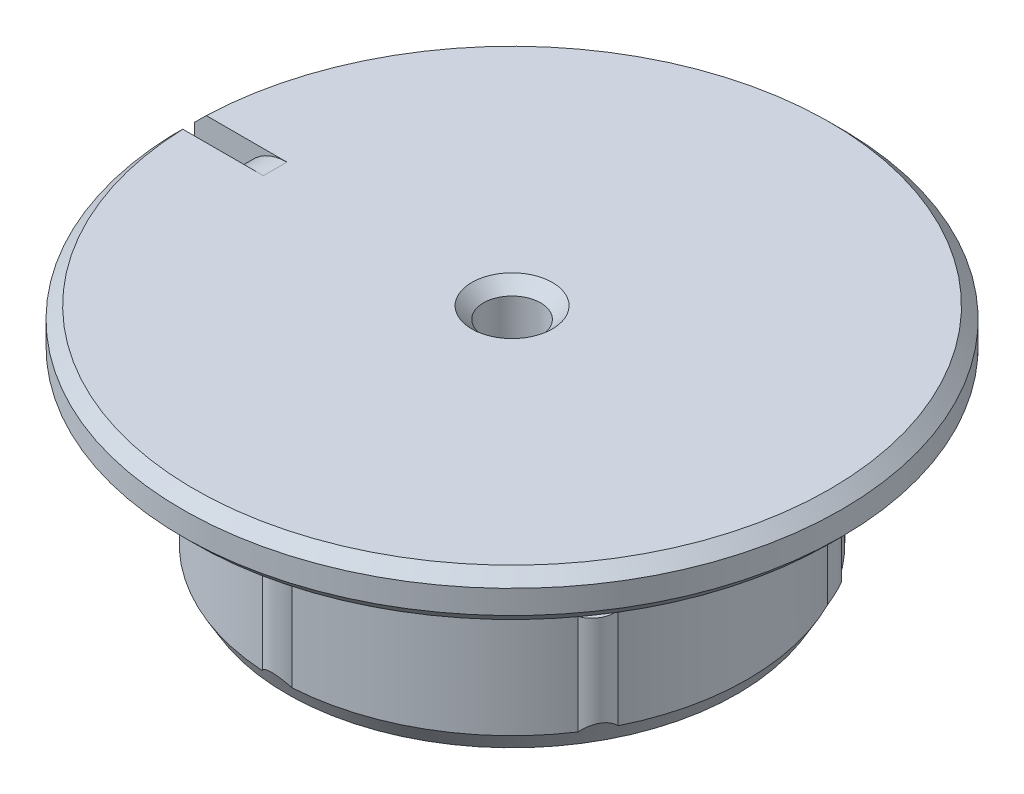
ISO-10303-21;
HEADER;
FILE_DESCRIPTION(('STEP AP214'),'2;1');
FILE_NAME('part.step','',(''),(''),'','','');
FILE_SCHEMA(('AUTOMOTIVE_DESIGN { 1 0 10303 214 1 1 1 1 }'));
ENDSEC;
DATA;
#1=APPLICATION_CONTEXT('core data for automotive mechanical design processes');
#2=APPLICATION_PROTOCOL_DEFINITION('international standard','automotive_design',2000,#1);
#3=PRODUCT_CONTEXT('',#1,'mechanical');
#4=PRODUCT('Part','Part','',(#3));
#5=PRODUCT_RELATED_PRODUCT_CATEGORY('part','',(#4));
#6=PRODUCT_DEFINITION_FORMATION('','',#4);
#7=PRODUCT_DEFINITION_CONTEXT('part definition',#1,'design');
#8=PRODUCT_DEFINITION('design','',#6,#7);
#9=PRODUCT_DEFINITION_SHAPE('','',#8);
#10=(LENGTH_UNIT() NAMED_UNIT(*) SI_UNIT(.MILLI.,.METRE.));
#11=(NAMED_UNIT(*) PLANE_ANGLE_UNIT() SI_UNIT($,.RADIAN.));
#12=(NAMED_UNIT(*) SI_UNIT($,.STERADIAN.) SOLID_ANGLE_UNIT());
#13=UNCERTAINTY_MEASURE_WITH_UNIT(LENGTH_MEASURE(1.E-05),#10,'distance_accuracy_value','');
#14=(GEOMETRIC_REPRESENTATION_CONTEXT(3) GLOBAL_UNCERTAINTY_ASSIGNED_CONTEXT((#13)) GLOBAL_UNIT_ASSIGNED_CONTEXT((#10,
#11,#12)) REPRESENTATION_CONTEXT('',''));
#15=CARTESIAN_POINT('',(0.,0.,0.));
#16=DIRECTION('',(0.,0.,1.));
#17=DIRECTION('',(1.,0.,0.));
#18=AXIS2_PLACEMENT_3D('',#15,#16,#17);
#19=CARTESIAN_POINT('',(0.,0.,0.));
#20=DIRECTION('',(0.,-1.,0.));
#21=DIRECTION('',(0.,0.,-1.));
#22=AXIS2_PLACEMENT_3D('',#19,#20,#21);
#23=CYLINDRICAL_SURFACE('',#22,28.);
#24=DIRECTION('',(0.,-1.,0.));
#25=VECTOR('',#24,1.);
#26=CARTESIAN_POINT('',(-27.9821371592664,0.,-1.));
#27=LINE('',#26,#25);
#28=CARTESIAN_POINT('',(-27.9821371592664,18.,-1.));
#29=VERTEX_POINT('',#28);
#30=CARTESIAN_POINT('',(-27.9821371592664,16.,-1.));
#31=VERTEX_POINT('',#30);
#32=EDGE_CURVE('E284',#29,#31,#27,.T.);
#33=ORIENTED_EDGE('',*,*,#32,.F.);
#34=CARTESIAN_POINT('',(0.,18.,0.));
#35=DIRECTION('',(0.,1.,0.));
#36=DIRECTION('',(0.,0.,1.));
#37=AXIS2_PLACEMENT_3D('',#34,#35,#36);
#38=CIRCLE('',#37,28.);
#39=CARTESIAN_POINT('',(-27.9821371592664,18.,1.));
#40=VERTEX_POINT('',#39);
#41=EDGE_CURVE('E190',#29,#40,#38,.F.);
#42=ORIENTED_EDGE('',*,*,#41,.T.);
#43=DIRECTION('',(0.,-1.,0.));
#44=VECTOR('',#43,1.);
#45=CARTESIAN_POINT('',(-27.9821371592664,0.,1.));
#46=LINE('',#45,#44);
#47=CARTESIAN_POINT('',(-27.9821371592664,16.,1.));
#48=VERTEX_POINT('',#47);
#49=EDGE_CURVE('E181',#48,#40,#46,.F.);
#50=ORIENTED_EDGE('',*,*,#49,.F.);
#51=CARTESIAN_POINT('',(0.,16.,0.));
#52=DIRECTION('',(0.,-1.,0.));
#53=DIRECTION('',(0.,0.,-1.));
#54=AXIS2_PLACEMENT_3D('',#51,#52,#53);
#55=CIRCLE('',#54,28.);
#56=EDGE_CURVE('E225',#48,#31,#55,.F.);
#57=ORIENTED_EDGE('',*,*,#56,.T.);
#58=EDGE_LOOP('',(#33,#42,#50,#57));
#59=FACE_BOUND('',#58,.T.);
#60=ADVANCED_FACE('F50',(#59),#23,.T.);
#61=CARTESIAN_POINT('',(0.,0.,0.));
#62=DIRECTION('',(0.,-1.,0.));
#63=DIRECTION('',(0.,0.,-1.));
#64=AXIS2_PLACEMENT_3D('',#61,#62,#63);
#65=CYLINDRICAL_SURFACE('',#64,2.425);
#66=CARTESIAN_POINT('',(0.,18.,0.));
#67=DIRECTION('',(0.,1.,0.));
#68=DIRECTION('',(0.,0.,1.));
#69=AXIS2_PLACEMENT_3D('',#66,#67,#68);
#70=CIRCLE('',#69,2.425);
#71=CARTESIAN_POINT('',(0.,18.,2.425));
#72=VERTEX_POINT('',#71);
#73=EDGE_CURVE('E204',#72,#72,#70,.T.);
#74=ORIENTED_EDGE('',*,*,#73,.T.);
#75=EDGE_LOOP('',(#74));
#76=FACE_BOUND('',#75,.T.);
#77=CARTESIAN_POINT('',(0.,10.,0.));
#78=DIRECTION('',(0.,-1.,0.));
#79=DIRECTION('',(0.,0.,-1.));
#80=AXIS2_PLACEMENT_3D('',#77,#78,#79);
#81=CIRCLE('',#80,2.425);
#82=CARTESIAN_POINT('',(0.,10.,-2.425));
#83=VERTEX_POINT('',#82);
#84=EDGE_CURVE('E433',#83,#83,#81,.T.);
#85=ORIENTED_EDGE('',*,*,#84,.T.);
#86=EDGE_LOOP('',(#85));
#87=FACE_BOUND('',#86,.T.);
#88=ADVANCED_FACE('F320',(#76,#87),#65,.F.);
#89=CARTESIAN_POINT('',(0.,0.,0.));
#90=DIRECTION('',(0.,-1.,0.));
#91=DIRECTION('',(0.,0.,-1.));
#92=AXIS2_PLACEMENT_3D('',#89,#90,#91);
#93=CYLINDRICAL_SURFACE('',#92,20.);
#94=CARTESIAN_POINT('',(0.,1.49999999999998,0.));
#95=DIRECTION('',(0.,1.,0.));
#96=DIRECTION('',(0.,0.,1.));
#97=AXIS2_PLACEMENT_3D('',#94,#95,#96);
#98=CIRCLE('',#97,20.);
#99=CARTESIAN_POINT('',(-1.25,1.49999999999998,19.9608992783391));
#100=VERTEX_POINT('',#99);
#101=CARTESIAN_POINT('',(-16.661645857424,1.49999999999998,11.0629813939003));
#102=VERTEX_POINT('',#101);
#103=EDGE_CURVE('E487',#100,#102,#98,.F.);
#104=ORIENTED_EDGE('',*,*,#103,.F.);
#105=DIRECTION('',(0.,-1.,0.));
#106=VECTOR('',#105,1.);
#107=CARTESIAN_POINT('',(-1.25,72.1655980463775,19.9608992783391));
#108=LINE('',#107,#106);
#109=CARTESIAN_POINT('',(-1.25,9.99999999999999,19.9608992783391));
#110=VERTEX_POINT('',#109);
#111=EDGE_CURVE('E371',#110,#100,#108,.T.);
#112=ORIENTED_EDGE('',*,*,#111,.F.);
#113=CARTESIAN_POINT('',(0.,10.,0.));
#114=DIRECTION('',(0.,-1.,0.));
#115=DIRECTION('',(0.,0.,-1.));
#116=AXIS2_PLACEMENT_3D('',#113,#114,#115);
#117=CIRCLE('',#116,20.);
#118=CARTESIAN_POINT('',(1.25,9.99999999999999,19.9608992783391));
#119=VERTEX_POINT('',#118);
#120=EDGE_CURVE('E476',#110,#119,#117,.F.);
#121=ORIENTED_EDGE('',*,*,#120,.T.);
#122=DIRECTION('',(0.,-1.,0.));
#123=VECTOR('',#122,1.);
#124=CARTESIAN_POINT('',(1.25,72.1655980463775,19.9608992783391));
#125=LINE('',#124,#123);
#126=CARTESIAN_POINT('',(1.25,1.49999999999998,19.9608992783391));
#127=VERTEX_POINT('',#126);
#128=EDGE_CURVE('E391',#119,#127,#125,.T.);
#129=ORIENTED_EDGE('',*,*,#128,.T.);
#130=CARTESIAN_POINT('',(16.6616458574242,1.49999999999998,11.0629813939001));
#131=VERTEX_POINT('',#130);
#132=EDGE_CURVE('E493',#131,#127,#98,.F.);
#133=ORIENTED_EDGE('',*,*,#132,.F.);
#134=DIRECTION('',(0.,-1.,0.));
#135=VECTOR('',#134,1.);
#136=CARTESIAN_POINT('',(16.6616458574242,72.1655980463775,11.0629813939001));
#137=LINE('',#136,#135);
#138=CARTESIAN_POINT('',(16.6616458574242,9.99999999999999,11.0629813939001));
#139=VERTEX_POINT('',#138);
#140=EDGE_CURVE('E395',#139,#131,#137,.T.);
#141=ORIENTED_EDGE('',*,*,#140,.F.);
#142=CARTESIAN_POINT('',(17.9116458574242,9.99999999999999,8.89791788443897));
#143=VERTEX_POINT('',#142);
#144=EDGE_CURVE('E506',#139,#143,#117,.F.);
#145=ORIENTED_EDGE('',*,*,#144,.T.);
#146=DIRECTION('',(0.,-1.,0.));
#147=VECTOR('',#146,1.);
#148=CARTESIAN_POINT('',(17.9116458574242,72.1655980463775,8.89791788443898));
#149=LINE('',#148,#147);
#150=CARTESIAN_POINT('',(17.9116458574242,1.49999999999998,8.89791788443898));
#151=VERTEX_POINT('',#150);
#152=EDGE_CURVE('E399',#143,#151,#149,.T.);
#153=ORIENTED_EDGE('',*,*,#152,.T.);
#154=CARTESIAN_POINT('',(17.9116458574241,1.49999999999999,-8.89791788443911));
#155=VERTEX_POINT('',#154);
#156=EDGE_CURVE('E295',#155,#151,#98,.F.);
#157=ORIENTED_EDGE('',*,*,#156,.F.);
#158=DIRECTION('',(0.,-1.,0.));
#159=VECTOR('',#158,1.);
#160=CARTESIAN_POINT('',(17.9116458574241,72.1655980463775,-8.89791788443911));
#161=LINE('',#160,#159);
#162=CARTESIAN_POINT('',(17.9116458574241,9.99999999999999,-8.89791788443911));
#163=VERTEX_POINT('',#162);
#164=EDGE_CURVE('E403',#163,#155,#161,.T.);
#165=ORIENTED_EDGE('',*,*,#164,.F.);
#166=CARTESIAN_POINT('',(16.6616458574241,9.99999999999999,-11.0629813939002));
#167=VERTEX_POINT('',#166);
#168=EDGE_CURVE('E438',#163,#167,#117,.F.);
#169=ORIENTED_EDGE('',*,*,#168,.T.);
#170=DIRECTION('',(0.,-1.,0.));
#171=VECTOR('',#170,1.);
#172=CARTESIAN_POINT('',(16.6616458574241,72.1655980463775,-11.0629813939002));
#173=LINE('',#172,#171);
#174=CARTESIAN_POINT('',(16.6616458574241,1.49999999999998,-11.0629813939002));
#175=VERTEX_POINT('',#174);
#176=EDGE_CURVE('E407',#167,#175,#173,.T.);
#177=ORIENTED_EDGE('',*,*,#176,.T.);
#178=CARTESIAN_POINT('',(1.24999999999986,1.49999999999998,-19.9608992783392));
#179=VERTEX_POINT('',#178);
#180=EDGE_CURVE('E485',#179,#175,#98,.F.);
#181=ORIENTED_EDGE('',*,*,#180,.F.);
#182=DIRECTION('',(0.,-1.,0.));
#183=VECTOR('',#182,1.);
#184=CARTESIAN_POINT('',(1.24999999999986,72.1655980463775,-19.9608992783392));
#185=LINE('',#184,#183);
#186=CARTESIAN_POINT('',(1.24999999999986,9.99999999999999,-19.9608992783392));
#187=VERTEX_POINT('',#186);
#188=EDGE_CURVE('E411',#187,#179,#185,.T.);
#189=ORIENTED_EDGE('',*,*,#188,.F.);
#190=CARTESIAN_POINT('',(-1.25000000000014,9.99999999999999,-19.9608992783391));
#191=VERTEX_POINT('',#190);
#192=EDGE_CURVE('E434',#187,#191,#117,.F.);
#193=ORIENTED_EDGE('',*,*,#192,.T.);
#194=DIRECTION('',(0.,-1.,0.));
#195=VECTOR('',#194,1.);
#196=CARTESIAN_POINT('',(-1.25000000000014,72.1655980463775,-19.9608992783391));
#197=LINE('',#196,#195);
#198=CARTESIAN_POINT('',(-1.25000000000014,1.49999999999998,-19.9608992783391));
#199=VERTEX_POINT('',#198);
#200=EDGE_CURVE('E415',#191,#199,#197,.T.);
#201=ORIENTED_EDGE('',*,*,#200,.T.);
#202=CARTESIAN_POINT('',(-16.6616458574243,1.49999999999998,-11.0629813939));
#203=VERTEX_POINT('',#202);
#204=EDGE_CURVE('E291',#203,#199,#98,.F.);
#205=ORIENTED_EDGE('',*,*,#204,.F.);
#206=DIRECTION('',(0.,-1.,0.));
#207=VECTOR('',#206,1.);
#208=CARTESIAN_POINT('',(-16.6616458574243,72.1655980463775,-11.0629813939));
#209=LINE('',#208,#207);
#210=CARTESIAN_POINT('',(-16.6616458574243,9.99999999999999,-11.0629813939));
#211=VERTEX_POINT('',#210);
#212=EDGE_CURVE('E419',#211,#203,#209,.T.);
#213=ORIENTED_EDGE('',*,*,#212,.F.);
#214=CARTESIAN_POINT('',(-17.9116458574242,9.99999999999999,-8.89791788443886));
#215=VERTEX_POINT('',#214);
#216=EDGE_CURVE('E439',#211,#215,#117,.F.);
#217=ORIENTED_EDGE('',*,*,#216,.T.);
#218=DIRECTION('',(0.,-1.,0.));
#219=VECTOR('',#218,1.);
#220=CARTESIAN_POINT('',(-17.9116458574242,72.1655980463775,-8.89791788443886));
#221=LINE('',#220,#219);
#222=CARTESIAN_POINT('',(-17.9116458574242,1.49999999999998,-8.89791788443886));
#223=VERTEX_POINT('',#222);
#224=EDGE_CURVE('E423',#215,#223,#221,.T.);
#225=ORIENTED_EDGE('',*,*,#224,.T.);
#226=CARTESIAN_POINT('',(-17.9116458574241,1.49999999999998,8.89791788443924));
#227=VERTEX_POINT('',#226);
#228=EDGE_CURVE('E294',#227,#223,#98,.F.);
#229=ORIENTED_EDGE('',*,*,#228,.F.);
#230=DIRECTION('',(0.,-1.,0.));
#231=VECTOR('',#230,1.);
#232=CARTESIAN_POINT('',(-17.9116458574241,72.1655980463775,8.89791788443924));
#233=LINE('',#232,#231);
#234=CARTESIAN_POINT('',(-17.9116458574241,9.99999999999999,8.89791788443924));
#235=VERTEX_POINT('',#234);
#236=EDGE_CURVE('E356',#235,#227,#233,.T.);
#237=ORIENTED_EDGE('',*,*,#236,.F.);
#238=CARTESIAN_POINT('',(-16.661645857424,10.,11.0629813939003));
#239=VERTEX_POINT('',#238);
#240=EDGE_CURVE('E472',#235,#239,#117,.F.);
#241=ORIENTED_EDGE('',*,*,#240,.T.);
#242=DIRECTION('',(0.,-1.,0.));
#243=VECTOR('',#242,1.);
#244=CARTESIAN_POINT('',(-16.661645857424,72.1655980463775,11.0629813939003));
#245=LINE('',#244,#243);
#246=EDGE_CURVE('E350',#239,#102,#245,.T.);
#247=ORIENTED_EDGE('',*,*,#246,.T.);
#248=EDGE_LOOP('',(#104,#112,#121,#129,#133,#141,#145,#153,#157,#165,#169,#177,#181,#189,#193,
#201,#205,#213,#217,#225,#229,#237,#241,#247));
#249=FACE_BOUND('',#248,.T.);
#250=CARTESIAN_POINT('',(0.,15.,0.));
#251=DIRECTION('',(0.,-1.,0.));
#252=DIRECTION('',(0.,0.,-1.));
#253=AXIS2_PLACEMENT_3D('',#250,#251,#252);
#254=CIRCLE('',#253,20.);
#255=CARTESIAN_POINT('',(0.,15.,-20.));
#256=VERTEX_POINT('',#255);
#257=EDGE_CURVE('E206',#256,#256,#254,.T.);
#258=ORIENTED_EDGE('',*,*,#257,.T.);
#259=EDGE_LOOP('',(#258));
#260=FACE_BOUND('',#259,.T.);
#261=ADVANCED_FACE('F323',(#249,#260),#93,.T.);
#262=CARTESIAN_POINT('',(20.,15.,0.));
#263=DIRECTION('',(0.,-1.,0.));
#264=DIRECTION('',(0.,0.,-1.));
#265=AXIS2_PLACEMENT_3D('',#262,#263,#264);
#266=PLANE('',#265);
#267=DIRECTION('',(1.,0.,0.));
#268=VECTOR('',#267,1.);
#269=CARTESIAN_POINT('',(20.,15.,-1.));
#270=LINE('',#269,#268);
#271=CARTESIAN_POINT('',(-26.9814751264641,15.,-1.));
#272=VERTEX_POINT('',#271);
#273=CARTESIAN_POINT('',(-24.13,15.,-1.));
#274=VERTEX_POINT('',#273);
#275=EDGE_CURVE('E283',#272,#274,#270,.T.);
#276=ORIENTED_EDGE('',*,*,#275,.F.);
#277=CARTESIAN_POINT('',(0.,15.,0.));
#278=DIRECTION('',(0.,-1.,0.));
#279=DIRECTION('',(0.,0.,-1.));
#280=AXIS2_PLACEMENT_3D('',#277,#278,#279);
#281=CIRCLE('',#280,27.);
#282=CARTESIAN_POINT('',(-26.9814751264641,15.,1.));
#283=VERTEX_POINT('',#282);
#284=EDGE_CURVE('E219',#272,#283,#281,.T.);
#285=ORIENTED_EDGE('',*,*,#284,.T.);
#286=DIRECTION('',(-1.,0.,0.));
#287=VECTOR('',#286,1.);
#288=CARTESIAN_POINT('',(20.,15.,1.));
#289=LINE('',#288,#287);
#290=CARTESIAN_POINT('',(-24.13,15.,1.));
#291=VERTEX_POINT('',#290);
#292=EDGE_CURVE('E261',#291,#283,#289,.T.);
#293=ORIENTED_EDGE('',*,*,#292,.F.);
#294=DIRECTION('',(0.,0.,1.));
#295=VECTOR('',#294,1.);
#296=CARTESIAN_POINT('',(-24.13,15.,0.));
#297=LINE('',#296,#295);
#298=EDGE_CURVE('E287',#274,#291,#297,.T.);
#299=ORIENTED_EDGE('',*,*,#298,.F.);
#300=EDGE_LOOP('',(#276,#285,#293,#299));
#301=FACE_BOUND('',#300,.T.);
#302=ORIENTED_EDGE('',*,*,#257,.F.);
#303=EDGE_LOOP('',(#302));
#304=FACE_BOUND('',#303,.T.);
#305=ADVANCED_FACE('F328',(#301,#304),#266,.T.);
#306=CARTESIAN_POINT('',(28.,19.,0.));
#307=DIRECTION('',(0.,1.,0.));
#308=DIRECTION('',(0.,0.,1.));
#309=AXIS2_PLACEMENT_3D('',#306,#307,#308);
#310=PLANE('',#309);
#311=DIRECTION('',(0.,0.,1.));
#312=VECTOR('',#311,1.);
#313=CARTESIAN_POINT('',(-20.13,19.,1.));
#314=LINE('',#313,#312);
#315=CARTESIAN_POINT('',(-20.13,19.,-1.));
#316=VERTEX_POINT('',#315);
#317=CARTESIAN_POINT('',(-20.13,19.,1.));
#318=VERTEX_POINT('',#317);
#319=EDGE_CURVE('E192',#316,#318,#314,.T.);
#320=ORIENTED_EDGE('',*,*,#319,.T.);
#321=DIRECTION('',(-1.,0.,0.));
#322=VECTOR('',#321,1.);
#323=CARTESIAN_POINT('',(-24.13,19.,1.));
#324=LINE('',#323,#322);
#325=CARTESIAN_POINT('',(-26.9814751264641,19.,1.));
#326=VERTEX_POINT('',#325);
#327=EDGE_CURVE('E66',#318,#326,#324,.T.);
#328=ORIENTED_EDGE('',*,*,#327,.T.);
#329=CARTESIAN_POINT('',(0.,19.,0.));
#330=DIRECTION('',(0.,1.,0.));
#331=DIRECTION('',(0.,0.,1.));
#332=AXIS2_PLACEMENT_3D('',#329,#330,#331);
#333=CIRCLE('',#332,27.);
#334=CARTESIAN_POINT('',(-26.9814751264641,19.,-1.));
#335=VERTEX_POINT('',#334);
#336=EDGE_CURVE('E188',#326,#335,#333,.T.);
#337=ORIENTED_EDGE('',*,*,#336,.T.);
#338=DIRECTION('',(1.,0.,0.));
#339=VECTOR('',#338,1.);
#340=CARTESIAN_POINT('',(-28.,19.,-1.));
#341=LINE('',#340,#339);
#342=EDGE_CURVE('E74',#335,#316,#341,.T.);
#343=ORIENTED_EDGE('',*,*,#342,.T.);
#344=EDGE_LOOP('',(#320,#328,#337,#343));
#345=FACE_BOUND('',#344,.T.);
#346=CARTESIAN_POINT('',(0.,19.,0.));
#347=DIRECTION('',(0.,1.,0.));
#348=DIRECTION('',(0.,0.,1.));
#349=AXIS2_PLACEMENT_3D('',#346,#347,#348);
#350=CIRCLE('',#349,3.425);
#351=CARTESIAN_POINT('',(0.,19.,3.425));
#352=VERTEX_POINT('',#351);
#353=EDGE_CURVE('E198',#352,#352,#350,.F.);
#354=ORIENTED_EDGE('',*,*,#353,.T.);
#355=EDGE_LOOP('',(#354));
#356=FACE_BOUND('',#355,.T.);
#357=ADVANCED_FACE('F195',(#345,#356),#310,.T.);
#358=CARTESIAN_POINT('',(20.,10.,0.));
#359=DIRECTION('',(0.,-1.,0.));
#360=DIRECTION('',(0.,0.,-1.));
#361=AXIS2_PLACEMENT_3D('',#358,#359,#360);
#362=PLANE('',#361);
#363=ORIENTED_EDGE('',*,*,#84,.F.);
#364=EDGE_LOOP('',(#363));
#365=FACE_BOUND('',#364,.T.);
#366=ADVANCED_FACE('F327',(#365),#362,.F.);
#367=ORIENTED_EDGE('',*,*,#192,.F.);
#368=CARTESIAN_POINT('',(-1.28889434080405E-13,9.99999999999999,-18.4887533378139));
#369=DIRECTION('',(0.,-1.,0.));
#370=DIRECTION('',(0.,0.,-1.));
#371=AXIS2_PLACEMENT_3D('',#368,#369,#370);
#372=CIRCLE('',#371,1.93124666218612);
#373=EDGE_CURVE('E370',#187,#191,#372,.F.);
#374=ORIENTED_EDGE('',*,*,#373,.T.);
#375=EDGE_LOOP('',(#367,#374));
#376=FACE_BOUND('',#375,.T.);
#377=ADVANCED_FACE('F448',(#376),#362,.F.);
#378=CARTESIAN_POINT('',(-1.28889434080405E-13,72.1655980463775,-18.4887533378139));
#379=DIRECTION('',(0.,-1.,0.));
#380=DIRECTION('',(0.,0.,-1.));
#381=AXIS2_PLACEMENT_3D('',#378,#379,#380);
#382=CYLINDRICAL_SURFACE('',#381,1.93124666218612);
#383=CARTESIAN_POINT('',(-1.25020000000014,1.49972805010007,-19.9607294348362));
#384=CARTESIAN_POINT('',(-1.2207066332916,1.53981916787765,-19.985767371141));
#385=CARTESIAN_POINT('',(-1.18989789146837,1.57922191823542,-20.0104197828914));
#386=CARTESIAN_POINT('',(-1.12534979140516,1.65637079541773,-20.0587665190645));
#387=CARTESIAN_POINT('',(-1.09160330122204,1.69411253578031,-20.082458294987));
#388=CARTESIAN_POINT('',(-1.02047965700987,1.7680220822365,-20.1289254034876));
#389=CARTESIAN_POINT('',(-0.983054451885645,1.80415654853797,-20.1516809136323));
#390=CARTESIAN_POINT('',(-0.904847031077971,1.87363359053969,-20.1954967657592));
#391=CARTESIAN_POINT('',(-0.864068281709403,1.90697897892875,-20.2165588146878));
#392=CARTESIAN_POINT('',(-0.764563755572861,1.98092757882383,-20.2633277091637));
#393=CARTESIAN_POINT('',(-0.70442138060374,2.02018911874751,-20.2882075066367));
#394=CARTESIAN_POINT('',(-0.577932252093125,2.0903172013141,-20.3327074757655));
#395=CARTESIAN_POINT('',(-0.511617824283118,2.12122450247498,-20.3523531764499));
#396=CARTESIAN_POINT('',(-0.385723735893647,2.16780301582305,-20.3819864876623));
#397=CARTESIAN_POINT('',(-0.32705383671853,2.18520884313483,-20.3930719533443));
#398=CARTESIAN_POINT('',(-0.207038395799102,2.21150122828735,-20.4098236142027));
#399=CARTESIAN_POINT('',(-0.145693243846003,2.22038902292023,-20.4154905961258));
#400=CARTESIAN_POINT('',(-0.0218861792790748,2.22882967787434,-20.4208723662955));
#401=CARTESIAN_POINT('',(0.0405787129482565,2.22835213063706,-20.4205677659035));
#402=CARTESIAN_POINT('',(0.164403845439246,2.21803402711594,-20.4139891860534));
#403=CARTESIAN_POINT('',(0.225763793997371,2.20819103423102,-20.4077136531421));
#404=CARTESIAN_POINT('',(0.342821526981113,2.18071233446175,-20.3902082784543));
#405=CARTESIAN_POINT('',(0.398649901237067,2.16346353945458,-20.3792244593882));
#406=CARTESIAN_POINT('',(0.506805542308034,2.12246897835158,-20.3531464113119));
#407=CARTESIAN_POINT('',(0.559131911495792,2.09872155441699,-20.3380511334488));
#408=CARTESIAN_POINT('',(0.690385098958304,2.02995930861851,-20.2943969553379));
#409=CARTESIAN_POINT('',(0.766247814573187,1.98077080067395,-20.2632184163356));
#410=CARTESIAN_POINT('',(0.908108103554778,1.87287872202714,-20.1950047389027));
#411=CARTESIAN_POINT('',(0.974064491160314,1.81413743292533,-20.1579463992831));
#412=CARTESIAN_POINT('',(1.07496874722131,1.71225454955475,-20.0938528780957));
#413=CARTESIAN_POINT('',(1.11260058760502,1.67099754122616,-20.0679419857442));
#414=CARTESIAN_POINT('',(1.18405795260217,1.58666714940036,-20.0150782673562));
#415=CARTESIAN_POINT('',(1.2179133131552,1.54361234613781,-19.9881362641643));
#416=CARTESIAN_POINT('',(1.25019999999986,1.49972805010007,-19.9607294348362));
#417=B_SPLINE_CURVE_WITH_KNOTS('',3,(#383,#384,#385,#386,#387,#388,#389,#390,#391,#392,#393,
#394,#395,#396,#397,#398,#399,#400,#401,#402,#403,#404,#405,#406,#407,#408,#409,#410,#411,#412,
#413,#414,#415,#416),.UNSPECIFIED.,.F.,.F.,(4,2,2,2,2,2,2,2,2,2,2,2,2,2,2,2,4),(0.,
0.16716171857769,0.334741218439061,0.504910644683918,0.674906338177656,0.902196786283045,
1.12835745386626,1.3141619236634,1.49993941113432,1.68632018382677,1.87274946033009,
2.05043984869946,2.22817560926528,2.51346384268765,2.79990715580073,2.98444832982624,
3.16740917206833),.UNSPECIFIED.);
#418=EDGE_CURVE('E304',#199,#179,#417,.T.);
#419=ORIENTED_EDGE('',*,*,#418,.F.);
#420=ORIENTED_EDGE('',*,*,#200,.F.);
#421=ORIENTED_EDGE('',*,*,#373,.F.);
#422=ORIENTED_EDGE('',*,*,#188,.T.);
#423=EDGE_LOOP('',(#419,#420,#421,#422));
#424=FACE_BOUND('',#423,.T.);
#425=ADVANCED_FACE('F452',(#424),#382,.T.);
#426=ORIENTED_EDGE('',*,*,#168,.F.);
#427=CARTESIAN_POINT('',(16.0117300748511,9.99999999999999,-9.24437666890701));
#428=DIRECTION('',(0.,-1.,0.));
#429=DIRECTION('',(0.,0.,-1.));
#430=AXIS2_PLACEMENT_3D('',#427,#428,#429);
#431=CIRCLE('',#430,1.93124666218612);
#432=EDGE_CURVE('E375',#163,#167,#431,.F.);
#433=ORIENTED_EDGE('',*,*,#432,.T.);
#434=EDGE_LOOP('',(#426,#433));
#435=FACE_BOUND('',#434,.T.);
#436=ADVANCED_FACE('F454',(#435),#362,.F.);
#437=CARTESIAN_POINT('',(16.0117300748511,72.1655980463775,-9.24437666890701));
#438=DIRECTION('',(0.,-1.,0.));
#439=DIRECTION('',(0.,0.,-1.));
#440=AXIS2_PLACEMENT_3D('',#437,#438,#439);
#441=CYLINDRICAL_SURFACE('',#440,1.93124666218612);
#442=CARTESIAN_POINT('',(16.6614458574248,1.49977987928173,-11.0630528556098));
#443=CARTESIAN_POINT('',(16.6978741810932,1.53986805210067,-11.0500294174004));
#444=CARTESIAN_POINT('',(16.7346262689322,1.57926787749585,-11.0356741646831));
#445=CARTESIAN_POINT('',(16.8087659131285,1.65641096082648,-11.0039468645402));
#446=CARTESIAN_POINT('',(16.8461548280135,1.69414983291238,-10.9865673677368));
#447=CARTESIAN_POINT('',(16.9219541782522,1.7680536881778,-10.9482061947117));
#448=CARTESIAN_POINT('',(16.9603714706787,1.80418533432286,-10.9271729998265));
#449=CARTESIAN_POINT('',(17.0374164168995,1.87365691313216,-10.881352117257));
#450=CARTESIAN_POINT('',(17.0760438159193,1.90699965797938,-10.856568284149));
#451=CARTESIAN_POINT('',(17.1662963965108,1.98094449941296,-10.7937793123544));
#452=CARTESIAN_POINT('',(17.2179136050469,2.02020471929653,-10.7541336298328));
#453=CARTESIAN_POINT('',(17.3196950625857,2.09032998409853,-10.6668393721544));
#454=CARTESIAN_POINT('',(17.3698652584574,2.12123578882352,-10.6192315564795));
#455=CARTESIAN_POINT('',(17.4584739669597,2.16781140932384,-10.5250197292468));
#456=CARTESIAN_POINT('',(17.4974084091399,2.18521587597889,-10.4797525002931));
#457=CARTESIAN_POINT('',(17.5719217601022,2.21150555066418,-10.384191463833));
#458=CARTESIAN_POINT('',(17.6075011551603,2.22039199500162,-10.3338983869494));
#459=CARTESIAN_POINT('',(17.6740634797077,2.22883007817628,-10.229369320281));
#460=CARTESIAN_POINT('',(17.7050311110781,2.22835131655399,-10.1751210593858));
#461=CARTESIAN_POINT('',(17.7612444570182,2.21803105540722,-10.0645967778519));
#462=CARTESIAN_POINT('',(17.7864886802292,2.20818711904656,-10.0083202331168));
#463=CARTESIAN_POINT('',(17.8298559688711,2.18070669562056,-9.89819294493435));
#464=CARTESIAN_POINT('',(17.8482573052486,2.16345699486162,-9.84435210758128));
#465=CARTESIAN_POINT('',(17.8797497152273,2.12246072170894,-9.73764739003603));
#466=CARTESIAN_POINT('',(17.8928394306738,2.09871249026931,-9.68478376300539));
#467=CARTESIAN_POINT('',(17.9206592436748,2.02994753858408,-9.54928666586366));
#468=CARTESIAN_POINT('',(17.9315884259087,1.98075697768016,-9.46799710881794));
#469=CARTESIAN_POINT('',(17.9434420583224,1.87286079091355,-9.31103352763247));
#470=CARTESIAN_POINT('',(17.9443258315176,1.81411745525713,-9.2353835664224));
#471=CARTESIAN_POINT('',(17.9392703699167,1.71224502202071,-9.11596606903186));
#472=CARTESIAN_POINT('',(17.9356479483693,1.67100142444392,-9.07043535369955));
#473=CARTESIAN_POINT('',(17.9255993717117,1.58669896712146,-8.98214753066171));
#474=CARTESIAN_POINT('',(17.9191974840942,1.54365866993932,-8.93937001560925));
#475=CARTESIAN_POINT('',(17.9116093755848,1.49978929427875,-8.89771788443911));
#476=B_SPLINE_CURVE_WITH_KNOTS('',3,(#442,#443,#444,#445,#446,#447,#448,#449,#450,#451,#452,
#453,#454,#455,#456,#457,#458,#459,#460,#461,#462,#463,#464,#465,#466,#467,#468,#469,#470,#471,
#472,#473,#474,#475),.UNSPECIFIED.,.F.,.F.,(4,2,2,2,2,2,2,2,2,2,2,2,2,2,2,2,4),(0.,
0.167152012893545,0.334721741869963,0.50488116235712,0.67486688083953,0.90215539201748,
1.12831412171709,1.31411667921693,1.49989226521694,1.6862709984072,1.87269824096394,
2.05038925740165,2.228125679954,2.51341996664194,2.79986908899909,2.98435026531545,
3.1672521472227),.UNSPECIFIED.);
#477=EDGE_CURVE('E515',#175,#155,#476,.T.);
#478=ORIENTED_EDGE('',*,*,#477,.F.);
#479=ORIENTED_EDGE('',*,*,#176,.F.);
#480=ORIENTED_EDGE('',*,*,#432,.F.);
#481=ORIENTED_EDGE('',*,*,#164,.T.);
#482=EDGE_LOOP('',(#478,#479,#480,#481));
#483=FACE_BOUND('',#482,.T.);
#484=ADVANCED_FACE('F514',(#483),#441,.T.);
#485=ORIENTED_EDGE('',*,*,#144,.F.);
#486=CARTESIAN_POINT('',(16.0117300748512,9.99999999999999,9.2443766689069));
#487=DIRECTION('',(0.,-1.,0.));
#488=DIRECTION('',(0.,0.,-1.));
#489=AXIS2_PLACEMENT_3D('',#486,#487,#488);
#490=CIRCLE('',#489,1.93124666218612);
#491=EDGE_CURVE('E379',#139,#143,#490,.F.);
#492=ORIENTED_EDGE('',*,*,#491,.T.);
#493=EDGE_LOOP('',(#485,#492));
#494=FACE_BOUND('',#493,.T.);
#495=ADVANCED_FACE('F470',(#494),#362,.F.);
#496=CARTESIAN_POINT('',(16.0117300748512,72.1655980463775,9.2443766689069));
#497=DIRECTION('',(0.,-1.,0.));
#498=DIRECTION('',(0.,0.,-1.));
#499=AXIS2_PLACEMENT_3D('',#496,#497,#498);
#500=CYLINDRICAL_SURFACE('',#499,1.93124666218612);
#501=CARTESIAN_POINT('',(17.9116093755848,1.49978929427875,8.89771788443898));
#502=CARTESIAN_POINT('',(17.9185446780151,1.53987693212292,8.93577720289727));
#503=CARTESIAN_POINT('',(17.9244884879618,1.57927622617629,8.9747828001228));
#504=CARTESIAN_POINT('',(17.9340812484319,1.65641825701107,9.05485268468535));
#505=CARTESIAN_POINT('',(17.9377244270414,1.69415660805419,9.09592187305174));
#506=CARTESIAN_POINT('',(17.942401997674,1.76805942951292,9.18074595260773));
#507=CARTESIAN_POINT('',(17.9433952025484,1.80419056339286,9.22453254070916));
#508=CARTESIAN_POINT('',(17.942235353794,1.87366114984295,9.31416509661627));
#509=CARTESIAN_POINT('',(17.9400855108225,1.90700341450418,9.3600089165859));
#510=CARTESIAN_POINT('',(17.9308347126749,1.98094757320501,9.4695639975008));
#511=CARTESIAN_POINT('',(17.9223089828499,2.02020755328294,9.53408864023645));
#512=CARTESIAN_POINT('',(17.8976003298013,2.09033230618611,9.66588103760527));
#513=CARTESIAN_POINT('',(17.8814556788572,2.12123783905425,9.73313356277953));
#514=CARTESIAN_POINT('',(17.8441698999059,2.16781293403866,9.85697671850756));
#515=CARTESIAN_POINT('',(17.8244344246008,2.18521715352288,9.91332845355933));
#516=CARTESIAN_POINT('',(17.7789325872494,2.21150633582161,10.0256391944857));
#517=CARTESIAN_POINT('',(17.753167101017,2.22039253486075,10.0815982561786));
#518=CARTESIAN_POINT('',(17.6959232759535,2.22883015082985,10.1915071352382));
#519=CARTESIAN_POINT('',(17.6644266618435,2.22835116862115,10.2454498397701));
#520=CARTESIAN_POINT('',(17.5968164304399,2.21803051558753,10.3493937857821));
#521=CARTESIAN_POINT('',(17.5607016135374,2.20818640781542,10.3993939976986));
#522=CARTESIAN_POINT('',(17.4870121515995,2.18070567093223,10.4920145503531));
#523=CARTESIAN_POINT('',(17.4495852113646,2.16345580519211,10.5348709151765));
#524=CARTESIAN_POINT('',(17.3729222896809,2.12245922076947,10.6154963331477));
#525=CARTESIAN_POINT('',(17.3336858484153,2.09871084308618,10.6532640835472));
#526=CARTESIAN_POINT('',(17.2302515074462,2.02994540510455,10.7451052367588));
#527=CARTESIAN_POINT('',(17.1653170180808,1.98075447742579,10.7952149524844));
#528=CARTESIAN_POINT('',(17.0353088938294,1.87285754701234,10.8839622123157));
#529=CARTESIAN_POINT('',(16.9702357596924,1.81411383392955,10.922552496763));
#530=CARTESIAN_POINT('',(16.8642884544488,1.71224017869213,10.9778832758349));
#531=CARTESIAN_POINT('',(16.8230457325037,1.67099569583875,10.9975117279879));
#532=CARTESIAN_POINT('',(16.741560479991,1.58669142457726,11.0329536030233));
#533=CARTESIAN_POINT('',(16.7013124095303,1.54365019952656,11.0487982473583));
#534=CARTESIAN_POINT('',(16.6614458574249,1.49977987928172,11.0630528556097));
#535=B_SPLINE_CURVE_WITH_KNOTS('',3,(#501,#502,#503,#504,#505,#506,#507,#508,#509,#510,#511,
#512,#513,#514,#515,#516,#517,#518,#519,#520,#521,#522,#523,#524,#525,#526,#527,#528,#529,#530,
#531,#532,#533,#534),.UNSPECIFIED.,.F.,.F.,(4,2,2,2,2,2,2,2,2,2,2,2,2,2,2,2,4),(0.,
0.167150249766184,0.334718203772107,0.504875806789811,0.674859713387353,0.902147872690386,
1.12830625027869,1.31410846047654,1.49988370102099,1.68626206306179,1.87268893683802,
2.0503800710091,2.22811661021969,2.51341196415996,2.79986217434639,2.98434683641234,
3.16725214806366),.UNSPECIFIED.);
#536=EDGE_CURVE('E351',#151,#131,#535,.T.);
#537=ORIENTED_EDGE('',*,*,#536,.F.);
#538=ORIENTED_EDGE('',*,*,#152,.F.);
#539=ORIENTED_EDGE('',*,*,#491,.F.);
#540=ORIENTED_EDGE('',*,*,#140,.T.);
#541=EDGE_LOOP('',(#537,#538,#539,#540));
#542=FACE_BOUND('',#541,.T.);
#543=ADVANCED_FACE('F530',(#542),#500,.T.);
#544=CARTESIAN_POINT('',(0.,72.1655980463775,18.4887533378139));
#545=DIRECTION('',(0.,-1.,0.));
#546=DIRECTION('',(0.,0.,-1.));
#547=AXIS2_PLACEMENT_3D('',#544,#545,#546);
#548=CYLINDRICAL_SURFACE('',#547,1.93124666218612);
#549=CARTESIAN_POINT('',(1.2502,1.49972805010007,19.9607294348362));
#550=CARTESIAN_POINT('',(1.22070663329146,1.53981916787765,19.985767371141));
#551=CARTESIAN_POINT('',(1.18989789146823,1.57922191823542,20.0104197828914));
#552=CARTESIAN_POINT('',(1.12534979140501,1.65637079541773,20.0587665190645));
#553=CARTESIAN_POINT('',(1.0916033012219,1.69411253578032,20.082458294987));
#554=CARTESIAN_POINT('',(1.02047965700973,1.7680220822365,20.1289254034876));
#555=CARTESIAN_POINT('',(0.983054451885501,1.80415654853797,20.1516809136323));
#556=CARTESIAN_POINT('',(0.904847031077827,1.8736335905397,20.1954967657592));
#557=CARTESIAN_POINT('',(0.86406828170926,1.90697897892875,20.2165588146878));
#558=CARTESIAN_POINT('',(0.764563755572719,1.98092757882383,20.2633277091638));
#559=CARTESIAN_POINT('',(0.704421380603597,2.02018911874752,20.2882075066367));
#560=CARTESIAN_POINT('',(0.577932252092979,2.0903172013141,20.3327074757655));
#561=CARTESIAN_POINT('',(0.511617824282973,2.12122450247498,20.3523531764499));
#562=CARTESIAN_POINT('',(0.385723735893502,2.16780301582306,20.3819864876623));
#563=CARTESIAN_POINT('',(0.327053836718385,2.18520884313483,20.3930719533443));
#564=CARTESIAN_POINT('',(0.207038395798957,2.21150122828735,20.4098236142027));
#565=CARTESIAN_POINT('',(0.145693243845858,2.22038902292024,20.4154905961258));
#566=CARTESIAN_POINT('',(0.0218861792789295,2.22882967787434,20.4208723662955));
#567=CARTESIAN_POINT('',(-0.0405787129484012,2.22835213063706,20.4205677659035));
#568=CARTESIAN_POINT('',(-0.16440384543939,2.21803402711594,20.4139891860534));
#569=CARTESIAN_POINT('',(-0.225763793997516,2.20819103423102,20.4077136531421));
#570=CARTESIAN_POINT('',(-0.342821526981257,2.18071233446175,20.3902082784543));
#571=CARTESIAN_POINT('',(-0.39864990123721,2.16346353945458,20.3792244593882));
#572=CARTESIAN_POINT('',(-0.506805542308176,2.12246897835158,20.3531464113119));
#573=CARTESIAN_POINT('',(-0.559131911495935,2.09872155441699,20.3380511334488));
#574=CARTESIAN_POINT('',(-0.690385098958449,2.02995930861851,20.2943969553379));
#575=CARTESIAN_POINT('',(-0.766247814573332,1.98077080067395,20.2632184163356));
#576=CARTESIAN_POINT('',(-0.908108103554923,1.87287872202714,20.1950047389027));
#577=CARTESIAN_POINT('',(-0.974064491160457,1.81413743292533,20.1579463992831));
#578=CARTESIAN_POINT('',(-1.07496874722145,1.71225454955475,20.0938528780957));
#579=CARTESIAN_POINT('',(-1.11260058760515,1.67099754122615,20.0679419857442));
#580=CARTESIAN_POINT('',(-1.18405795260231,1.58666714940036,20.0150782673562));
#581=CARTESIAN_POINT('',(-1.21791331315534,1.54361234613782,19.9881362641643));
#582=CARTESIAN_POINT('',(-1.2502,1.49972805010007,19.9607294348362));
#583=B_SPLINE_CURVE_WITH_KNOTS('',3,(#549,#550,#551,#552,#553,#554,#555,#556,#557,#558,#559,
#560,#561,#562,#563,#564,#565,#566,#567,#568,#569,#570,#571,#572,#573,#574,#575,#576,#577,#578,
#579,#580,#581,#582),.UNSPECIFIED.,.F.,.F.,(4,2,2,2,2,2,2,2,2,2,2,2,2,2,2,2,4),(0.,
0.16716171857769,0.334741218439062,0.504910644683918,0.674906338177657,0.902196786283046,
1.12835745386627,1.3141619236634,1.49993941113432,1.68632018382677,1.87274946033009,
2.05043984869946,2.22817560926528,2.51346384268765,2.79990715580073,2.98444832982624,
3.16740917206833),.UNSPECIFIED.);
#584=EDGE_CURVE('E492',#127,#100,#583,.T.);
#585=ORIENTED_EDGE('',*,*,#584,.F.);
#586=ORIENTED_EDGE('',*,*,#128,.F.);
#587=CARTESIAN_POINT('',(0.,9.99999999999999,18.4887533378139));
#588=DIRECTION('',(0.,-1.,0.));
#589=DIRECTION('',(0.,0.,-1.));
#590=AXIS2_PLACEMENT_3D('',#587,#588,#589);
#591=CIRCLE('',#590,1.93124666218612);
#592=EDGE_CURVE('E383',#110,#119,#591,.F.);
#593=ORIENTED_EDGE('',*,*,#592,.F.);
#594=ORIENTED_EDGE('',*,*,#111,.T.);
#595=EDGE_LOOP('',(#585,#586,#593,#594));
#596=FACE_BOUND('',#595,.T.);
#597=ADVANCED_FACE('F468',(#596),#548,.T.);
#598=ORIENTED_EDGE('',*,*,#120,.F.);
#599=ORIENTED_EDGE('',*,*,#592,.T.);
#600=EDGE_LOOP('',(#598,#599));
#601=FACE_BOUND('',#600,.T.);
#602=ADVANCED_FACE('F463',(#601),#362,.F.);
#603=ORIENTED_EDGE('',*,*,#240,.F.);
#604=CARTESIAN_POINT('',(-16.011730074851,9.99999999999999,9.24437666890712));
#605=DIRECTION('',(0.,-1.,0.));
#606=DIRECTION('',(0.,0.,-1.));
#607=AXIS2_PLACEMENT_3D('',#604,#605,#606);
#608=CIRCLE('',#607,1.93124666218612);
#609=EDGE_CURVE('E387',#235,#239,#608,.F.);
#610=ORIENTED_EDGE('',*,*,#609,.T.);
#611=EDGE_LOOP('',(#603,#610));
#612=FACE_BOUND('',#611,.T.);
#613=ADVANCED_FACE('F316',(#612),#362,.F.);
#614=CARTESIAN_POINT('',(-16.011730074851,72.1655980463775,9.24437666890712));
#615=DIRECTION('',(0.,-1.,0.));
#616=DIRECTION('',(0.,0.,-1.));
#617=AXIS2_PLACEMENT_3D('',#614,#615,#616);
#618=CYLINDRICAL_SURFACE('',#617,1.93124666218612);
#619=CARTESIAN_POINT('',(-16.6614458574247,1.49977987928172,11.0630528556099));
#620=CARTESIAN_POINT('',(-16.6978741810932,1.53986805210066,11.0500294174005));
#621=CARTESIAN_POINT('',(-16.7346262689321,1.57926787749585,11.0356741646832));
#622=CARTESIAN_POINT('',(-16.8087659131284,1.65641096082648,11.0039468645403));
#623=CARTESIAN_POINT('',(-16.8461548280134,1.69414983291238,10.9865673677369));
#624=CARTESIAN_POINT('',(-16.9219541782521,1.76805368817779,10.9482061947119));
#625=CARTESIAN_POINT('',(-16.9603714706786,1.80418533432285,10.9271729998266));
#626=CARTESIAN_POINT('',(-17.0374164168994,1.87365691313215,10.8813521172571));
#627=CARTESIAN_POINT('',(-17.0760438159192,1.90699965797937,10.8565682841492));
#628=CARTESIAN_POINT('',(-17.1662963965107,1.98094449941295,10.7937793123545));
#629=CARTESIAN_POINT('',(-17.2179136050468,2.02020471929652,10.754133629833));
#630=CARTESIAN_POINT('',(-17.3196950625856,2.09032998409852,10.6668393721545));
#631=CARTESIAN_POINT('',(-17.3698652584573,2.12123578882352,10.6192315564796));
#632=CARTESIAN_POINT('',(-17.4584739669596,2.16781140932383,10.5250197292469));
#633=CARTESIAN_POINT('',(-17.4974084091398,2.18521587597888,10.4797525002933));
#634=CARTESIAN_POINT('',(-17.5719217601021,2.21150555066417,10.3841914638331));
#635=CARTESIAN_POINT('',(-17.6075011551602,2.22039199500161,10.3338983869496));
#636=CARTESIAN_POINT('',(-17.6740634797076,2.22883007817628,10.2293693202811));
#637=CARTESIAN_POINT('',(-17.705031111078,2.22835131655399,10.1751210593859));
#638=CARTESIAN_POINT('',(-17.7612444570181,2.21803105540721,10.064596777852));
#639=CARTESIAN_POINT('',(-17.7864886802291,2.20818711904656,10.0083202331169));
#640=CARTESIAN_POINT('',(-17.8298559688711,2.18070669562055,9.89819294493446));
#641=CARTESIAN_POINT('',(-17.8482573052485,2.1634569948616,9.8443521075814));
#642=CARTESIAN_POINT('',(-17.8797497152273,2.12246072170893,9.73764739003614));
#643=CARTESIAN_POINT('',(-17.8928394306737,2.0987124902693,9.68478376300551));
#644=CARTESIAN_POINT('',(-17.9206592436747,2.02994753858407,9.54928666586377));
#645=CARTESIAN_POINT('',(-17.9315884259086,1.98075697768015,9.46799710881805));
#646=CARTESIAN_POINT('',(-17.9434420583224,1.87286079091354,9.31103352763259));
#647=CARTESIAN_POINT('',(-17.9443258315175,1.81411745525711,9.23538356642252));
#648=CARTESIAN_POINT('',(-17.9392703699166,1.7122450220207,9.11596606903198));
#649=CARTESIAN_POINT('',(-17.9356479483692,1.67100142444391,9.07043535369968));
#650=CARTESIAN_POINT('',(-17.9255993717116,1.58669896712146,8.98214753066184));
#651=CARTESIAN_POINT('',(-17.9191974840942,1.54365866993932,8.93937001560938));
#652=CARTESIAN_POINT('',(-17.9116093755847,1.49978929427875,8.89771788443924));
#653=B_SPLINE_CURVE_WITH_KNOTS('',3,(#619,#620,#621,#622,#623,#624,#625,#626,#627,#628,#629,
#630,#631,#632,#633,#634,#635,#636,#637,#638,#639,#640,#641,#642,#643,#644,#645,#646,#647,#648,
#649,#650,#651,#652),.UNSPECIFIED.,.F.,.F.,(4,2,2,2,2,2,2,2,2,2,2,2,2,2,2,2,4),(0.,
0.167152012893547,0.334721741869966,0.504881162357122,0.674866880839534,0.902155392017481,
1.12831412171709,1.31411667921694,1.49989226521694,1.68627099840721,1.87269824096395,
2.05038925740166,2.22812567995401,2.51341996664195,2.7998690889991,2.98435026531545,
3.16725214722269),.UNSPECIFIED.);
#654=EDGE_CURVE('E296',#102,#227,#653,.T.);
#655=ORIENTED_EDGE('',*,*,#654,.F.);
#656=ORIENTED_EDGE('',*,*,#246,.F.);
#657=ORIENTED_EDGE('',*,*,#609,.F.);
#658=ORIENTED_EDGE('',*,*,#236,.T.);
#659=EDGE_LOOP('',(#655,#656,#657,#658));
#660=FACE_BOUND('',#659,.T.);
#661=ADVANCED_FACE('F311',(#660),#618,.T.);
#662=ORIENTED_EDGE('',*,*,#216,.F.);
#663=CARTESIAN_POINT('',(-16.0117300748512,9.99999999999999,-9.24437666890678));
#664=DIRECTION('',(0.,-1.,0.));
#665=DIRECTION('',(0.,0.,-1.));
#666=AXIS2_PLACEMENT_3D('',#663,#664,#665);
#667=CIRCLE('',#666,1.93124666218612);
#668=EDGE_CURVE('E366',#211,#215,#667,.F.);
#669=ORIENTED_EDGE('',*,*,#668,.T.);
#670=EDGE_LOOP('',(#662,#669));
#671=FACE_BOUND('',#670,.T.);
#672=ADVANCED_FACE('F315',(#671),#362,.F.);
#673=CARTESIAN_POINT('',(-16.0117300748512,72.1655980463775,-9.24437666890678));
#674=DIRECTION('',(0.,-1.,0.));
#675=DIRECTION('',(0.,0.,-1.));
#676=AXIS2_PLACEMENT_3D('',#673,#674,#675);
#677=CYLINDRICAL_SURFACE('',#676,1.93124666218612);
#678=CARTESIAN_POINT('',(-17.9116093755849,1.49978929427874,-8.89771788443885));
#679=CARTESIAN_POINT('',(-17.9185446780152,1.53987693212291,-8.93577720289715));
#680=CARTESIAN_POINT('',(-17.9244884879619,1.57927622617628,-8.97478280012267));
#681=CARTESIAN_POINT('',(-17.934081248432,1.65641825701106,-9.05485268468522));
#682=CARTESIAN_POINT('',(-17.9377244270415,1.69415660805418,-9.09592187305162));
#683=CARTESIAN_POINT('',(-17.942401997674,1.76805942951291,-9.1807459526076));
#684=CARTESIAN_POINT('',(-17.9433952025485,1.80419056339285,-9.22453254070903));
#685=CARTESIAN_POINT('',(-17.9422353537941,1.87366114984294,-9.31416509661614));
#686=CARTESIAN_POINT('',(-17.9400855108225,1.90700341450417,-9.36000891658577));
#687=CARTESIAN_POINT('',(-17.930834712675,1.98094757320501,-9.46956399750067));
#688=CARTESIAN_POINT('',(-17.9223089828499,2.02020755328294,-9.53408864023632));
#689=CARTESIAN_POINT('',(-17.8976003298013,2.0903323061861,-9.66588103760514));
#690=CARTESIAN_POINT('',(-17.8814556788573,2.12123783905424,-9.7331335627794));
#691=CARTESIAN_POINT('',(-17.8441698999059,2.16781293403865,-9.85697671850743));
#692=CARTESIAN_POINT('',(-17.8244344246009,2.18521715352287,-9.9133284535592));
#693=CARTESIAN_POINT('',(-17.7789325872495,2.21150633582161,-10.0256391944856));
#694=CARTESIAN_POINT('',(-17.7531671010171,2.22039253486074,-10.0815982561785));
#695=CARTESIAN_POINT('',(-17.6959232759536,2.22883015082984,-10.1915071352381));
#696=CARTESIAN_POINT('',(-17.6644266618436,2.22835116862114,-10.24544983977));
#697=CARTESIAN_POINT('',(-17.5968164304399,2.21803051558753,-10.3493937857819));
#698=CARTESIAN_POINT('',(-17.5607016135375,2.20818640781541,-10.3993939976985));
#699=CARTESIAN_POINT('',(-17.4870121515995,2.18070567093222,-10.492014550353));
#700=CARTESIAN_POINT('',(-17.4495852113647,2.1634558051921,-10.5348709151764));
#701=CARTESIAN_POINT('',(-17.3729222896809,2.12245922076945,-10.6154963331476));
#702=CARTESIAN_POINT('',(-17.3336858484153,2.09871084308618,-10.6532640835471));
#703=CARTESIAN_POINT('',(-17.2302515074463,2.02994540510455,-10.7451052367587));
#704=CARTESIAN_POINT('',(-17.1653170180809,1.98075447742579,-10.7952149524843));
#705=CARTESIAN_POINT('',(-17.0353088938295,1.87285754701233,-10.8839622123155));
#706=CARTESIAN_POINT('',(-16.9702357596925,1.81411383392954,-10.9225524967629));
#707=CARTESIAN_POINT('',(-16.8642884544489,1.71224017869212,-10.9778832758348));
#708=CARTESIAN_POINT('',(-16.8230457325038,1.67099569583875,-10.9975117279878));
#709=CARTESIAN_POINT('',(-16.7415604799911,1.58669142457726,-11.0329536030232));
#710=CARTESIAN_POINT('',(-16.7013124095303,1.54365019952656,-11.0487982473582));
#711=CARTESIAN_POINT('',(-16.661445857425,1.49977987928173,-11.0630528556095));
#712=B_SPLINE_CURVE_WITH_KNOTS('',3,(#678,#679,#680,#681,#682,#683,#684,#685,#686,#687,#688,
#689,#690,#691,#692,#693,#694,#695,#696,#697,#698,#699,#700,#701,#702,#703,#704,#705,#706,#707,
#708,#709,#710,#711),.UNSPECIFIED.,.F.,.F.,(4,2,2,2,2,2,2,2,2,2,2,2,2,2,2,2,4),(0.,
0.167150249766184,0.334718203772105,0.504875806789808,0.67485971338735,0.90214787269038,
1.12830625027868,1.31410846047654,1.49988370102099,1.6862620630618,1.87268893683803,
2.0503800710091,2.2281166102197,2.51341196415996,2.79986217434639,2.98434683641233,
3.16725214806365),.UNSPECIFIED.);
#713=EDGE_CURVE('E199',#223,#203,#712,.T.);
#714=ORIENTED_EDGE('',*,*,#713,.F.);
#715=ORIENTED_EDGE('',*,*,#224,.F.);
#716=ORIENTED_EDGE('',*,*,#668,.F.);
#717=ORIENTED_EDGE('',*,*,#212,.T.);
#718=EDGE_LOOP('',(#714,#715,#716,#717));
#719=FACE_BOUND('',#718,.T.);
#720=ADVANCED_FACE('F318',(#719),#677,.T.);
#721=CARTESIAN_POINT('',(0.,-1.,0.));
#722=DIRECTION('',(0.,1.,0.));
#723=DIRECTION('',(0.,0.,1.));
#724=AXIS2_PLACEMENT_3D('',#721,#722,#723);
#725=CONICAL_SURFACE('',#724,18.5566243270259,0.523598775598303);
#726=CARTESIAN_POINT('',(0.,0.,0.));
#727=DIRECTION('',(0.,-1.,0.));
#728=DIRECTION('',(0.,0.,-1.));
#729=AXIS2_PLACEMENT_3D('',#726,#727,#728);
#730=CIRCLE('',#729,19.1339745962156);
#731=CARTESIAN_POINT('',(0.,0.,-19.1339745962156));
#732=VERTEX_POINT('',#731);
#733=EDGE_CURVE('E348',#732,#732,#730,.F.);
#734=ORIENTED_EDGE('',*,*,#733,.T.);
#735=EDGE_LOOP('',(#734));
#736=FACE_BOUND('',#735,.T.);
#737=ORIENTED_EDGE('',*,*,#536,.T.);
#738=ORIENTED_EDGE('',*,*,#132,.T.);
#739=ORIENTED_EDGE('',*,*,#584,.T.);
#740=ORIENTED_EDGE('',*,*,#103,.T.);
#741=ORIENTED_EDGE('',*,*,#654,.T.);
#742=ORIENTED_EDGE('',*,*,#228,.T.);
#743=ORIENTED_EDGE('',*,*,#713,.T.);
#744=ORIENTED_EDGE('',*,*,#204,.T.);
#745=ORIENTED_EDGE('',*,*,#418,.T.);
#746=ORIENTED_EDGE('',*,*,#180,.T.);
#747=ORIENTED_EDGE('',*,*,#477,.T.);
#748=ORIENTED_EDGE('',*,*,#156,.T.);
#749=EDGE_LOOP('',(#737,#738,#739,#740,#741,#742,#743,#744,#745,#746,#747,#748));
#750=FACE_BOUND('',#749,.T.);
#751=ADVANCED_FACE('F248',(#736,#750),#725,.T.);
#752=CARTESIAN_POINT('',(0.,0.,0.));
#753=DIRECTION('',(0.,-1.,0.));
#754=DIRECTION('',(0.,0.,-1.));
#755=AXIS2_PLACEMENT_3D('',#752,#753,#754);
#756=PLANE('',#755);
#757=ORIENTED_EDGE('',*,*,#733,.F.);
#758=EDGE_LOOP('',(#757));
#759=FACE_BOUND('',#758,.T.);
#760=ADVANCED_FACE('F337',(#759),#756,.T.);
#761=CARTESIAN_POINT('',(0.,19.,0.));
#762=DIRECTION('',(0.,1.,0.));
#763=DIRECTION('',(0.,0.,1.));
#764=AXIS2_PLACEMENT_3D('',#761,#762,#763);
#765=CONICAL_SURFACE('',#764,3.425,0.78539816339745);
#766=ORIENTED_EDGE('',*,*,#73,.F.);
#767=EDGE_LOOP('',(#766));
#768=FACE_BOUND('',#767,.T.);
#769=ORIENTED_EDGE('',*,*,#353,.F.);
#770=EDGE_LOOP('',(#769));
#771=FACE_BOUND('',#770,.T.);
#772=ADVANCED_FACE('F271',(#768,#771),#765,.F.);
#773=CARTESIAN_POINT('',(0.,15.,0.));
#774=DIRECTION('',(0.,1.,0.));
#775=DIRECTION('',(0.,0.,1.));
#776=AXIS2_PLACEMENT_3D('',#773,#774,#775);
#777=CONICAL_SURFACE('',#776,27.,0.785398163397445);
#778=CARTESIAN_POINT('',(-31.981681326641,19.99731145704,-1.));
#779=CARTESIAN_POINT('',(-31.2316910265446,19.2476881640971,-1.));
#780=CARTESIAN_POINT('',(-30.4816884955177,18.4980771075221,-1.));
#781=CARTESIAN_POINT('',(-28.9816512004861,16.9988872503537,-1.));
#782=CARTESIAN_POINT('',(-28.2316164364816,16.2493084497601,-1.));
#783=CARTESIAN_POINT('',(-26.7315068986643,14.7501908820895,-1.));
#784=CARTESIAN_POINT('',(-25.9814321248515,14.0006521150125,-1.));
#785=CARTESIAN_POINT('',(-24.4812297365358,12.5016274586534,-1.));
#786=CARTESIAN_POINT('',(-23.7311021220328,11.7521415693715,-1.));
#787=CARTESIAN_POINT('',(-22.9809416735787,11.00268854296,-1.));
#788=B_SPLINE_CURVE_WITH_KNOTS('',3,(#778,#779,#780,#781,#782,#783,#784,#785,#786,#787),
.UNSPECIFIED.,.F.,.F.,(4,2,2,2,4),(0.,3.1811609180555,6.36232182620252,9.5434827387683,
12.7246436613258),.UNSPECIFIED.);
#789=EDGE_CURVE('E276',#31,#272,#788,.T.);
#790=ORIENTED_EDGE('',*,*,#789,.F.);
#791=ORIENTED_EDGE('',*,*,#56,.F.);
#792=CARTESIAN_POINT('',(-22.9809416735787,11.00268854296,1.));
#793=CARTESIAN_POINT('',(-23.7311021220328,11.7521415693715,1.));
#794=CARTESIAN_POINT('',(-24.4812297365358,12.5016274586534,1.));
#795=CARTESIAN_POINT('',(-25.9814321248515,14.0006521150125,1.));
#796=CARTESIAN_POINT('',(-26.7315068986643,14.7501908820895,1.));
#797=CARTESIAN_POINT('',(-28.2316164364816,16.2493084497601,1.));
#798=CARTESIAN_POINT('',(-28.9816512004861,16.9988872503537,1.));
#799=CARTESIAN_POINT('',(-30.4816884955176,18.4980771075221,1.));
#800=CARTESIAN_POINT('',(-31.2316910265446,19.2476881640971,1.));
#801=CARTESIAN_POINT('',(-31.981681326641,19.99731145704,1.));
#802=B_SPLINE_CURVE_WITH_KNOTS('',3,(#792,#793,#794,#795,#796,#797,#798,#799,#800,#801),
.UNSPECIFIED.,.F.,.F.,(4,2,2,2,4),(0.,3.18116092255754,6.36232183512332,9.54348274327033,
12.7246436613258),.UNSPECIFIED.);
#803=EDGE_CURVE('E253',#283,#48,#802,.T.);
#804=ORIENTED_EDGE('',*,*,#803,.F.);
#805=ORIENTED_EDGE('',*,*,#284,.F.);
#806=EDGE_LOOP('',(#790,#791,#804,#805));
#807=FACE_BOUND('',#806,.T.);
#808=ADVANCED_FACE('F264',(#807),#777,.T.);
#809=CARTESIAN_POINT('',(0.,18.,0.));
#810=DIRECTION('',(0.,-1.,0.));
#811=DIRECTION('',(0.,0.,-1.));
#812=AXIS2_PLACEMENT_3D('',#809,#810,#811);
#813=CONICAL_SURFACE('',#812,28.,0.785398163397447);
#814=CARTESIAN_POINT('',(-22.9809416735787,22.9973114570399,-1.));
#815=CARTESIAN_POINT('',(-23.7311021220328,22.2478584306285,-1.));
#816=CARTESIAN_POINT('',(-24.4812297365358,21.4983725413466,-1.));
#817=CARTESIAN_POINT('',(-25.9814321248515,19.9993478849875,-1.));
#818=CARTESIAN_POINT('',(-26.7315068986643,19.2498091179105,-1.));
#819=CARTESIAN_POINT('',(-28.2316164364816,17.7506915502399,-1.));
#820=CARTESIAN_POINT('',(-28.9816512004861,17.0011127496463,-1.));
#821=CARTESIAN_POINT('',(-30.4816884955177,15.5019228924779,-1.));
#822=CARTESIAN_POINT('',(-31.2316910265446,14.7523118359029,-1.));
#823=CARTESIAN_POINT('',(-31.981681326641,14.00268854296,-1.));
#824=B_SPLINE_CURVE_WITH_KNOTS('',3,(#814,#815,#816,#817,#818,#819,#820,#821,#822,#823),
.UNSPECIFIED.,.F.,.F.,(4,2,2,2,4),(0.,3.18116092255755,6.36232183512333,9.54348274327036,
12.7246436613259),.UNSPECIFIED.);
#825=EDGE_CURVE('E176',#335,#29,#824,.T.);
#826=ORIENTED_EDGE('',*,*,#825,.F.);
#827=ORIENTED_EDGE('',*,*,#336,.F.);
#828=CARTESIAN_POINT('',(-31.981681326641,14.00268854296,1.));
#829=CARTESIAN_POINT('',(-31.2316910265446,14.7523118359029,1.));
#830=CARTESIAN_POINT('',(-30.4816884955177,15.5019228924779,1.));
#831=CARTESIAN_POINT('',(-28.9816512004861,17.0011127496463,1.));
#832=CARTESIAN_POINT('',(-28.2316164364816,17.7506915502399,1.));
#833=CARTESIAN_POINT('',(-26.7315068986643,19.2498091179105,1.));
#834=CARTESIAN_POINT('',(-25.9814321248515,19.9993478849875,1.));
#835=CARTESIAN_POINT('',(-24.4812297365358,21.4983725413466,1.));
#836=CARTESIAN_POINT('',(-23.7311021220328,22.2478584306285,1.));
#837=CARTESIAN_POINT('',(-22.9809416735787,22.9973114570399,1.));
#838=B_SPLINE_CURVE_WITH_KNOTS('',3,(#828,#829,#830,#831,#832,#833,#834,#835,#836,#837),
.UNSPECIFIED.,.F.,.F.,(4,2,2,2,4),(0.,3.18116091805551,6.36232182620254,9.54348273876833,
12.7246436613259),.UNSPECIFIED.);
#839=EDGE_CURVE('E193',#40,#326,#838,.T.);
#840=ORIENTED_EDGE('',*,*,#839,.F.);
#841=ORIENTED_EDGE('',*,*,#41,.F.);
#842=EDGE_LOOP('',(#826,#827,#840,#841));
#843=FACE_BOUND('',#842,.T.);
#844=ADVANCED_FACE('F186',(#843),#813,.T.);
#845=CARTESIAN_POINT('',(-28.,19.,-1.));
#846=DIRECTION('',(0.,0.,-1.));
#847=DIRECTION('',(-1.,0.,0.));
#848=AXIS2_PLACEMENT_3D('',#845,#846,#847);
#849=PLANE('',#848);
#850=ORIENTED_EDGE('',*,*,#275,.T.);
#851=CARTESIAN_POINT('',(-20.13,15.,-1.));
#852=DIRECTION('',(0.,0.,-1.));
#853=DIRECTION('',(-1.,0.,0.));
#854=AXIS2_PLACEMENT_3D('',#851,#852,#853);
#855=CIRCLE('',#854,4.);
#856=EDGE_CURVE('E13',#274,#316,#855,.T.);
#857=ORIENTED_EDGE('',*,*,#856,.T.);
#858=ORIENTED_EDGE('',*,*,#342,.F.);
#859=ORIENTED_EDGE('',*,*,#825,.T.);
#860=ORIENTED_EDGE('',*,*,#32,.T.);
#861=ORIENTED_EDGE('',*,*,#789,.T.);
#862=EDGE_LOOP('',(#850,#857,#858,#859,#860,#861));
#863=FACE_BOUND('',#862,.T.);
#864=ADVANCED_FACE('F175',(#863),#849,.F.);
#865=CARTESIAN_POINT('',(-24.13,19.,1.));
#866=DIRECTION('',(0.,0.,1.));
#867=DIRECTION('',(1.,0.,0.));
#868=AXIS2_PLACEMENT_3D('',#865,#866,#867);
#869=PLANE('',#868);
#870=ORIENTED_EDGE('',*,*,#292,.T.);
#871=ORIENTED_EDGE('',*,*,#803,.T.);
#872=ORIENTED_EDGE('',*,*,#49,.T.);
#873=ORIENTED_EDGE('',*,*,#839,.T.);
#874=ORIENTED_EDGE('',*,*,#327,.F.);
#875=CARTESIAN_POINT('',(-20.13,15.,1.));
#876=DIRECTION('',(0.,0.,1.));
#877=DIRECTION('',(1.,0.,0.));
#878=AXIS2_PLACEMENT_3D('',#875,#876,#877);
#879=CIRCLE('',#878,4.);
#880=EDGE_CURVE('E59',#318,#291,#879,.T.);
#881=ORIENTED_EDGE('',*,*,#880,.T.);
#882=EDGE_LOOP('',(#870,#871,#872,#873,#874,#881));
#883=FACE_BOUND('',#882,.T.);
#884=ADVANCED_FACE('F244',(#883),#869,.F.);
#885=CARTESIAN_POINT('',(-20.13,15.,0.));
#886=DIRECTION('',(0.,0.,-1.));
#887=DIRECTION('',(-1.,0.,0.));
#888=AXIS2_PLACEMENT_3D('',#885,#886,#887);
#889=CYLINDRICAL_SURFACE('',#888,4.);
#890=ORIENTED_EDGE('',*,*,#856,.F.);
#891=ORIENTED_EDGE('',*,*,#298,.T.);
#892=ORIENTED_EDGE('',*,*,#880,.F.);
#893=ORIENTED_EDGE('',*,*,#319,.F.);
#894=EDGE_LOOP('',(#890,#891,#892,#893));
#895=FACE_BOUND('',#894,.T.);
#896=ADVANCED_FACE('F52',(#895),#889,.T.);
#897=CLOSED_SHELL('',(#60,#88,#261,#305,#357,#366,#377,#425,#436,#484,#495,#543,#597,#602,#613,
#661,#672,#720,#751,#760,#772,#808,#844,#864,#884,#896));
#898=MANIFOLD_SOLID_BREP('B2',#897);
#899=ADVANCED_BREP_SHAPE_REPRESENTATION('',(#18,#898),#14);
#900=SHAPE_DEFINITION_REPRESENTATION(#9,#899);
ENDSEC;
END-ISO-10303-21;
